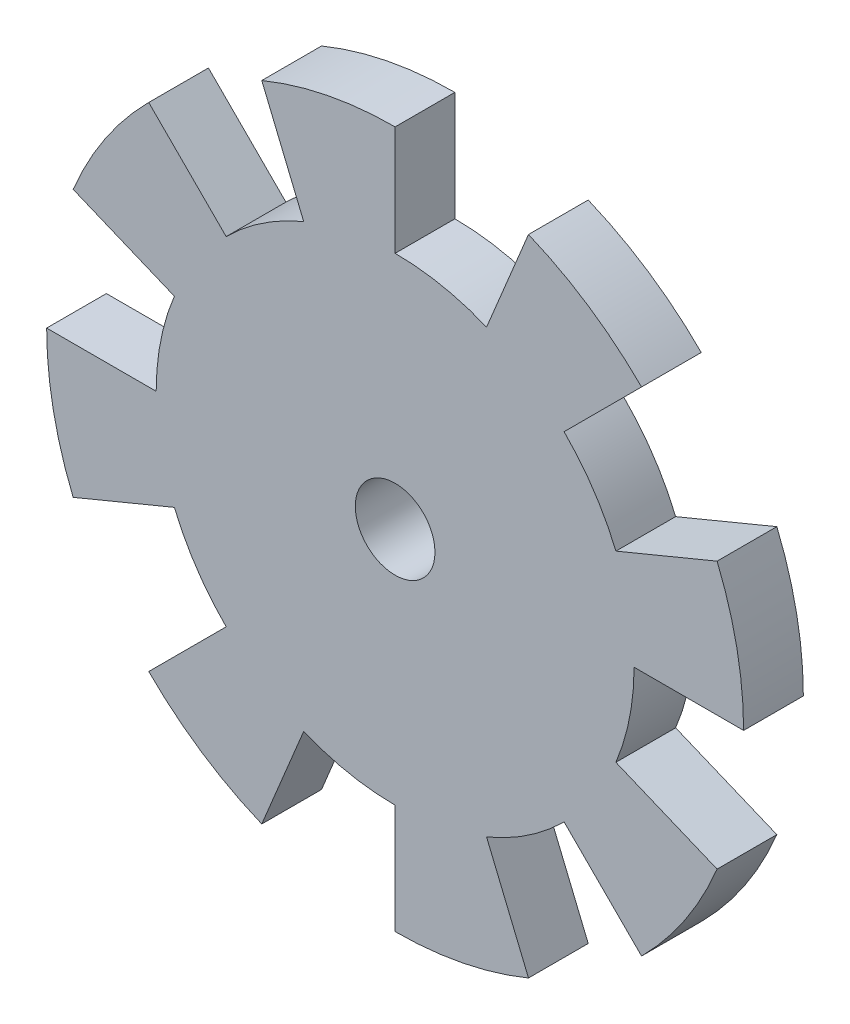
ISO-10303-21;
HEADER;
FILE_DESCRIPTION(('STEP AP214'),'2;1');
FILE_NAME('part.step','',(''),(''),'','','');
FILE_SCHEMA(('AUTOMOTIVE_DESIGN { 1 0 10303 214 1 1 1 1 }'));
ENDSEC;
DATA;
#1=APPLICATION_CONTEXT('core data for automotive mechanical design processes');
#2=APPLICATION_PROTOCOL_DEFINITION('international standard','automotive_design',2000,#1);
#3=PRODUCT_CONTEXT('',#1,'mechanical');
#4=PRODUCT('Part','Part','',(#3));
#5=PRODUCT_RELATED_PRODUCT_CATEGORY('part','',(#4));
#6=PRODUCT_DEFINITION_FORMATION('','',#4);
#7=PRODUCT_DEFINITION_CONTEXT('part definition',#1,'design');
#8=PRODUCT_DEFINITION('design','',#6,#7);
#9=PRODUCT_DEFINITION_SHAPE('','',#8);
#10=(LENGTH_UNIT() NAMED_UNIT(*) SI_UNIT(.MILLI.,.METRE.));
#11=(NAMED_UNIT(*) PLANE_ANGLE_UNIT() SI_UNIT($,.RADIAN.));
#12=(NAMED_UNIT(*) SI_UNIT($,.STERADIAN.) SOLID_ANGLE_UNIT());
#13=UNCERTAINTY_MEASURE_WITH_UNIT(LENGTH_MEASURE(1.E-05),#10,'distance_accuracy_value','');
#14=(GEOMETRIC_REPRESENTATION_CONTEXT(3) GLOBAL_UNCERTAINTY_ASSIGNED_CONTEXT((#13)) GLOBAL_UNIT_ASSIGNED_CONTEXT((#10,
#11,#12)) REPRESENTATION_CONTEXT('',''));
#15=CARTESIAN_POINT('',(0.,0.,0.));
#16=DIRECTION('',(0.,0.,1.));
#17=DIRECTION('',(1.,0.,0.));
#18=AXIS2_PLACEMENT_3D('',#15,#16,#17);
#19=CARTESIAN_POINT('',(0.,0.,6.));
#20=DIRECTION('',(0.,0.,-1.));
#21=DIRECTION('',(-1.,0.,0.));
#22=AXIS2_PLACEMENT_3D('',#19,#20,#21);
#23=CYLINDRICAL_SURFACE('',#22,24.);
#24=CARTESIAN_POINT('',(0.,0.,0.));
#25=DIRECTION('',(0.,0.,1.));
#26=DIRECTION('',(1.,0.,0.));
#27=AXIS2_PLACEMENT_3D('',#24,#25,#26);
#28=CIRCLE('',#27,24.);
#29=CARTESIAN_POINT('',(22.1731087802711,9.18440237676226,0.));
#30=VERTEX_POINT('',#29);
#31=CARTESIAN_POINT('',(16.9705627484782,16.9705627484772,0.));
#32=VERTEX_POINT('',#31);
#33=EDGE_CURVE('E281',#30,#32,#28,.T.);
#34=ORIENTED_EDGE('',*,*,#33,.T.);
#35=DIRECTION('',(0.,0.,-1.));
#36=VECTOR('',#35,1.);
#37=CARTESIAN_POINT('',(16.9705627484782,16.9705627484772,6.));
#38=LINE('',#37,#36);
#39=CARTESIAN_POINT('',(16.9705627484782,16.9705627484772,6.));
#40=VERTEX_POINT('',#39);
#41=EDGE_CURVE('E11',#40,#32,#38,.T.);
#42=ORIENTED_EDGE('',*,*,#41,.F.);
#43=CARTESIAN_POINT('',(0.,0.,6.));
#44=DIRECTION('',(0.,0.,1.));
#45=DIRECTION('',(1.,0.,0.));
#46=AXIS2_PLACEMENT_3D('',#43,#44,#45);
#47=CIRCLE('',#46,24.);
#48=CARTESIAN_POINT('',(22.1731087802711,9.18440237676226,6.));
#49=VERTEX_POINT('',#48);
#50=EDGE_CURVE('E441',#49,#40,#47,.T.);
#51=ORIENTED_EDGE('',*,*,#50,.F.);
#52=DIRECTION('',(0.,0.,-1.));
#53=VECTOR('',#52,1.);
#54=CARTESIAN_POINT('',(22.1731087802711,9.18440237676226,6.));
#55=LINE('',#54,#53);
#56=EDGE_CURVE('E52',#49,#30,#55,.T.);
#57=ORIENTED_EDGE('',*,*,#56,.T.);
#58=EDGE_LOOP('',(#34,#42,#51,#57));
#59=FACE_BOUND('',#58,.T.);
#60=ADVANCED_FACE('F35',(#59),#23,.T.);
#61=CARTESIAN_POINT('',(0.,0.,6.));
#62=DIRECTION('',(-0.707106781186527,0.707106781186567,0.));
#63=DIRECTION('',(-0.707106781186568,-0.707106781186528,0.));
#64=AXIS2_PLACEMENT_3D('',#61,#62,#63);
#65=PLANE('',#64);
#66=DIRECTION('',(0.707106781186568,0.707106781186528,0.));
#67=VECTOR('',#66,1.);
#68=CARTESIAN_POINT('',(0.,0.,0.));
#69=LINE('',#68,#67);
#70=CARTESIAN_POINT('',(24.7487373415292,24.7487373415278,0.));
#71=VERTEX_POINT('',#70);
#72=EDGE_CURVE('E283',#32,#71,#69,.T.);
#73=ORIENTED_EDGE('',*,*,#72,.T.);
#74=DIRECTION('',(0.,0.,-1.));
#75=VECTOR('',#74,1.);
#76=CARTESIAN_POINT('',(24.7487373415292,24.7487373415278,6.));
#77=LINE('',#76,#75);
#78=CARTESIAN_POINT('',(24.7487373415292,24.7487373415278,6.));
#79=VERTEX_POINT('',#78);
#80=EDGE_CURVE('E44',#79,#71,#77,.T.);
#81=ORIENTED_EDGE('',*,*,#80,.F.);
#82=DIRECTION('',(0.707106781186568,0.707106781186528,0.));
#83=VECTOR('',#82,1.);
#84=CARTESIAN_POINT('',(0.,0.,6.));
#85=LINE('',#84,#83);
#86=EDGE_CURVE('E163',#40,#79,#85,.T.);
#87=ORIENTED_EDGE('',*,*,#86,.F.);
#88=ORIENTED_EDGE('',*,*,#41,.T.);
#89=EDGE_LOOP('',(#73,#81,#87,#88));
#90=FACE_BOUND('',#89,.T.);
#91=ADVANCED_FACE('F508',(#90),#65,.F.);
#92=CARTESIAN_POINT('',(0.,0.,6.));
#93=DIRECTION('',(0.,0.,-1.));
#94=DIRECTION('',(-1.,0.,0.));
#95=AXIS2_PLACEMENT_3D('',#92,#93,#94);
#96=CYLINDRICAL_SURFACE('',#95,35.);
#97=CARTESIAN_POINT('',(0.,0.,0.));
#98=DIRECTION('',(0.,0.,1.));
#99=DIRECTION('',(1.,0.,0.));
#100=AXIS2_PLACEMENT_3D('',#97,#98,#99);
#101=CIRCLE('',#100,35.);
#102=CARTESIAN_POINT('',(13.3939201327785,32.335783637895,0.));
#103=VERTEX_POINT('',#102);
#104=EDGE_CURVE('E287',#71,#103,#101,.T.);
#105=ORIENTED_EDGE('',*,*,#104,.T.);
#106=DIRECTION('',(0.,0.,-1.));
#107=VECTOR('',#106,1.);
#108=CARTESIAN_POINT('',(13.3939201327785,32.335783637895,6.));
#109=LINE('',#108,#107);
#110=CARTESIAN_POINT('',(13.3939201327785,32.335783637895,6.));
#111=VERTEX_POINT('',#110);
#112=EDGE_CURVE('E418',#111,#103,#109,.T.);
#113=ORIENTED_EDGE('',*,*,#112,.F.);
#114=CARTESIAN_POINT('',(0.,0.,6.));
#115=DIRECTION('',(0.,0.,1.));
#116=DIRECTION('',(1.,0.,0.));
#117=AXIS2_PLACEMENT_3D('',#114,#115,#116);
#118=CIRCLE('',#117,35.);
#119=EDGE_CURVE('E425',#79,#111,#118,.T.);
#120=ORIENTED_EDGE('',*,*,#119,.F.);
#121=ORIENTED_EDGE('',*,*,#80,.T.);
#122=EDGE_LOOP('',(#105,#113,#120,#121));
#123=FACE_BOUND('',#122,.T.);
#124=ADVANCED_FACE('F423',(#123),#96,.T.);
#125=CARTESIAN_POINT('',(0.,0.,6.));
#126=DIRECTION('',(-0.923879532511283,0.382683432365098,0.));
#127=DIRECTION('',(-0.382683432365098,-0.923879532511284,0.));
#128=AXIS2_PLACEMENT_3D('',#125,#126,#127);
#129=PLANE('',#128);
#130=DIRECTION('',(0.382683432365098,0.923879532511284,0.));
#131=VECTOR('',#130,1.);
#132=CARTESIAN_POINT('',(0.,0.,0.));
#133=LINE('',#132,#131);
#134=CARTESIAN_POINT('',(9.18440237676243,22.173108780271,0.));
#135=VERTEX_POINT('',#134);
#136=EDGE_CURVE('E290',#135,#103,#133,.T.);
#137=ORIENTED_EDGE('',*,*,#136,.F.);
#138=DIRECTION('',(0.,0.,-1.));
#139=VECTOR('',#138,1.);
#140=CARTESIAN_POINT('',(9.18440237676243,22.173108780271,6.));
#141=LINE('',#140,#139);
#142=CARTESIAN_POINT('',(9.18440237676243,22.173108780271,6.));
#143=VERTEX_POINT('',#142);
#144=EDGE_CURVE('E416',#143,#135,#141,.T.);
#145=ORIENTED_EDGE('',*,*,#144,.F.);
#146=DIRECTION('',(0.382683432365098,0.923879532511284,0.));
#147=VECTOR('',#146,1.);
#148=CARTESIAN_POINT('',(0.,0.,6.));
#149=LINE('',#148,#147);
#150=EDGE_CURVE('E436',#143,#111,#149,.T.);
#151=ORIENTED_EDGE('',*,*,#150,.T.);
#152=ORIENTED_EDGE('',*,*,#112,.T.);
#153=EDGE_LOOP('',(#137,#145,#151,#152));
#154=FACE_BOUND('',#153,.T.);
#155=ADVANCED_FACE('F432',(#154),#129,.T.);
#156=CARTESIAN_POINT('',(0.,24.,0.));
#157=VERTEX_POINT('',#156);
#158=EDGE_CURVE('E285',#135,#157,#28,.T.);
#159=ORIENTED_EDGE('',*,*,#158,.T.);
#160=DIRECTION('',(0.,0.,-1.));
#161=VECTOR('',#160,1.);
#162=CARTESIAN_POINT('',(0.,24.,6.));
#163=LINE('',#162,#161);
#164=CARTESIAN_POINT('',(0.,24.,6.));
#165=VERTEX_POINT('',#164);
#166=EDGE_CURVE('E413',#165,#157,#163,.T.);
#167=ORIENTED_EDGE('',*,*,#166,.F.);
#168=EDGE_CURVE('E437',#143,#165,#47,.T.);
#169=ORIENTED_EDGE('',*,*,#168,.F.);
#170=ORIENTED_EDGE('',*,*,#144,.T.);
#171=EDGE_LOOP('',(#159,#167,#169,#170));
#172=FACE_BOUND('',#171,.T.);
#173=ADVANCED_FACE('F510',(#172),#23,.T.);
#174=CARTESIAN_POINT('',(0.,0.,6.));
#175=DIRECTION('',(-1.,0.,0.));
#176=DIRECTION('',(0.,0.,1.));
#177=AXIS2_PLACEMENT_3D('',#174,#175,#176);
#178=PLANE('',#177);
#179=DIRECTION('',(0.,1.,0.));
#180=VECTOR('',#179,1.);
#181=CARTESIAN_POINT('',(0.,0.,0.));
#182=LINE('',#181,#180);
#183=CARTESIAN_POINT('',(0.,35.,0.));
#184=VERTEX_POINT('',#183);
#185=EDGE_CURVE('E293',#157,#184,#182,.T.);
#186=ORIENTED_EDGE('',*,*,#185,.T.);
#187=DIRECTION('',(0.,0.,-1.));
#188=VECTOR('',#187,1.);
#189=CARTESIAN_POINT('',(0.,35.,6.));
#190=LINE('',#189,#188);
#191=CARTESIAN_POINT('',(0.,35.,6.));
#192=VERTEX_POINT('',#191);
#193=EDGE_CURVE('E410',#192,#184,#190,.T.);
#194=ORIENTED_EDGE('',*,*,#193,.F.);
#195=DIRECTION('',(0.,1.,0.));
#196=VECTOR('',#195,1.);
#197=CARTESIAN_POINT('',(0.,0.,6.));
#198=LINE('',#197,#196);
#199=EDGE_CURVE('E439',#165,#192,#198,.T.);
#200=ORIENTED_EDGE('',*,*,#199,.F.);
#201=ORIENTED_EDGE('',*,*,#166,.T.);
#202=EDGE_LOOP('',(#186,#194,#200,#201));
#203=FACE_BOUND('',#202,.T.);
#204=ADVANCED_FACE('F518',(#203),#178,.F.);
#205=CARTESIAN_POINT('',(0.,0.,6.));
#206=DIRECTION('',(0.,0.,-1.));
#207=DIRECTION('',(-1.,0.,0.));
#208=AXIS2_PLACEMENT_3D('',#205,#206,#207);
#209=CYLINDRICAL_SURFACE('',#208,35.);
#210=CARTESIAN_POINT('',(0.,0.,0.));
#211=DIRECTION('',(0.,0.,1.));
#212=DIRECTION('',(1.,0.,0.));
#213=AXIS2_PLACEMENT_3D('',#210,#211,#212);
#214=CIRCLE('',#213,35.);
#215=CARTESIAN_POINT('',(-13.3939201327763,32.3357836378952,0.));
#216=VERTEX_POINT('',#215);
#217=EDGE_CURVE('E295',#184,#216,#214,.T.);
#218=ORIENTED_EDGE('',*,*,#217,.T.);
#219=DIRECTION('',(0.,0.,-1.));
#220=VECTOR('',#219,1.);
#221=CARTESIAN_POINT('',(-13.3939201327763,32.3357836378952,6.));
#222=LINE('',#221,#220);
#223=CARTESIAN_POINT('',(-13.3939201327763,32.3357836378952,6.));
#224=VERTEX_POINT('',#223);
#225=EDGE_CURVE('E408',#224,#216,#222,.T.);
#226=ORIENTED_EDGE('',*,*,#225,.F.);
#227=CARTESIAN_POINT('',(0.,0.,6.));
#228=DIRECTION('',(0.,0.,1.));
#229=DIRECTION('',(1.,0.,0.));
#230=AXIS2_PLACEMENT_3D('',#227,#228,#229);
#231=CIRCLE('',#230,35.);
#232=EDGE_CURVE('E447',#192,#224,#231,.T.);
#233=ORIENTED_EDGE('',*,*,#232,.F.);
#234=ORIENTED_EDGE('',*,*,#193,.T.);
#235=EDGE_LOOP('',(#218,#226,#233,#234));
#236=FACE_BOUND('',#235,.T.);
#237=ADVANCED_FACE('F595',(#236),#209,.T.);
#238=CARTESIAN_POINT('',(0.,0.,6.));
#239=DIRECTION('',(-0.923879532511306,-0.382683432365043,0.));
#240=DIRECTION('',(0.382683432365043,-0.923879532511306,0.));
#241=AXIS2_PLACEMENT_3D('',#238,#239,#240);
#242=PLANE('',#241);
#243=DIRECTION('',(-0.382683432365043,0.923879532511306,0.));
#244=VECTOR('',#243,1.);
#245=CARTESIAN_POINT('',(0.,0.,0.));
#246=LINE('',#245,#244);
#247=CARTESIAN_POINT('',(-9.18440237676087,22.1731087802709,0.));
#248=VERTEX_POINT('',#247);
#249=EDGE_CURVE('E298',#248,#216,#246,.T.);
#250=ORIENTED_EDGE('',*,*,#249,.F.);
#251=DIRECTION('',(0.,0.,-1.));
#252=VECTOR('',#251,1.);
#253=CARTESIAN_POINT('',(-9.18440237676087,22.1731087802709,6.));
#254=LINE('',#253,#252);
#255=CARTESIAN_POINT('',(-9.18440237676087,22.1731087802709,6.));
#256=VERTEX_POINT('',#255);
#257=EDGE_CURVE('E406',#256,#248,#254,.T.);
#258=ORIENTED_EDGE('',*,*,#257,.F.);
#259=DIRECTION('',(-0.382683432365043,0.923879532511306,0.));
#260=VECTOR('',#259,1.);
#261=CARTESIAN_POINT('',(0.,0.,6.));
#262=LINE('',#261,#260);
#263=EDGE_CURVE('E449',#256,#224,#262,.T.);
#264=ORIENTED_EDGE('',*,*,#263,.T.);
#265=ORIENTED_EDGE('',*,*,#225,.T.);
#266=EDGE_LOOP('',(#250,#258,#264,#265));
#267=FACE_BOUND('',#266,.T.);
#268=ADVANCED_FACE('F587',(#267),#242,.T.);
#269=CARTESIAN_POINT('',(-16.970562748477,16.970562748477,0.));
#270=VERTEX_POINT('',#269);
#271=EDGE_CURVE('E301',#248,#270,#28,.T.);
#272=ORIENTED_EDGE('',*,*,#271,.T.);
#273=DIRECTION('',(0.,0.,-1.));
#274=VECTOR('',#273,1.);
#275=CARTESIAN_POINT('',(-16.970562748477,16.970562748477,6.));
#276=LINE('',#275,#274);
#277=CARTESIAN_POINT('',(-16.970562748477,16.970562748477,6.));
#278=VERTEX_POINT('',#277);
#279=EDGE_CURVE('E403',#278,#270,#276,.T.);
#280=ORIENTED_EDGE('',*,*,#279,.F.);
#281=EDGE_CURVE('E442',#256,#278,#47,.T.);
#282=ORIENTED_EDGE('',*,*,#281,.F.);
#283=ORIENTED_EDGE('',*,*,#257,.T.);
#284=EDGE_LOOP('',(#272,#280,#282,#283));
#285=FACE_BOUND('',#284,.T.);
#286=ADVANCED_FACE('F520',(#285),#23,.T.);
#287=CARTESIAN_POINT('',(0.,0.,6.));
#288=DIRECTION('',(-0.707106781186547,-0.707106781186548,0.));
#289=DIRECTION('',(0.707106781186548,-0.707106781186547,0.));
#290=AXIS2_PLACEMENT_3D('',#287,#288,#289);
#291=PLANE('',#290);
#292=DIRECTION('',(-0.707106781186548,0.707106781186547,0.));
#293=VECTOR('',#292,1.);
#294=CARTESIAN_POINT('',(0.,0.,0.));
#295=LINE('',#294,#293);
#296=CARTESIAN_POINT('',(-24.7487373415286,24.7487373415286,0.));
#297=VERTEX_POINT('',#296);
#298=EDGE_CURVE('E302',#270,#297,#295,.T.);
#299=ORIENTED_EDGE('',*,*,#298,.T.);
#300=DIRECTION('',(0.,0.,-1.));
#301=VECTOR('',#300,1.);
#302=CARTESIAN_POINT('',(-24.7487373415286,24.7487373415286,6.));
#303=LINE('',#302,#301);
#304=CARTESIAN_POINT('',(-24.7487373415286,24.7487373415286,6.));
#305=VERTEX_POINT('',#304);
#306=EDGE_CURVE('E400',#305,#297,#303,.T.);
#307=ORIENTED_EDGE('',*,*,#306,.F.);
#308=DIRECTION('',(-0.707106781186548,0.707106781186547,0.));
#309=VECTOR('',#308,1.);
#310=CARTESIAN_POINT('',(0.,0.,6.));
#311=LINE('',#310,#309);
#312=EDGE_CURVE('E452',#278,#305,#311,.T.);
#313=ORIENTED_EDGE('',*,*,#312,.F.);
#314=ORIENTED_EDGE('',*,*,#279,.T.);
#315=EDGE_LOOP('',(#299,#307,#313,#314));
#316=FACE_BOUND('',#315,.T.);
#317=ADVANCED_FACE('F586',(#316),#291,.F.);
#318=CARTESIAN_POINT('',(0.,0.,6.));
#319=DIRECTION('',(0.,0.,-1.));
#320=DIRECTION('',(-1.,0.,0.));
#321=AXIS2_PLACEMENT_3D('',#318,#319,#320);
#322=CYLINDRICAL_SURFACE('',#321,35.);
#323=CARTESIAN_POINT('',(0.,0.,0.));
#324=DIRECTION('',(0.,0.,1.));
#325=DIRECTION('',(1.,0.,0.));
#326=AXIS2_PLACEMENT_3D('',#323,#324,#325);
#327=CIRCLE('',#326,35.);
#328=CARTESIAN_POINT('',(-32.3357836378945,13.3939201327779,0.));
#329=VERTEX_POINT('',#328);
#330=EDGE_CURVE('E304',#297,#329,#327,.T.);
#331=ORIENTED_EDGE('',*,*,#330,.T.);
#332=DIRECTION('',(0.,0.,-1.));
#333=VECTOR('',#332,1.);
#334=CARTESIAN_POINT('',(-32.3357836378945,13.3939201327779,6.));
#335=LINE('',#334,#333);
#336=CARTESIAN_POINT('',(-32.3357836378945,13.3939201327779,6.));
#337=VERTEX_POINT('',#336);
#338=EDGE_CURVE('E398',#337,#329,#335,.T.);
#339=ORIENTED_EDGE('',*,*,#338,.F.);
#340=CARTESIAN_POINT('',(0.,0.,6.));
#341=DIRECTION('',(0.,0.,1.));
#342=DIRECTION('',(1.,0.,0.));
#343=AXIS2_PLACEMENT_3D('',#340,#341,#342);
#344=CIRCLE('',#343,35.);
#345=EDGE_CURVE('E454',#305,#337,#344,.T.);
#346=ORIENTED_EDGE('',*,*,#345,.F.);
#347=ORIENTED_EDGE('',*,*,#306,.T.);
#348=EDGE_LOOP('',(#331,#339,#346,#347));
#349=FACE_BOUND('',#348,.T.);
#350=ADVANCED_FACE('F582',(#349),#322,.T.);
#351=CARTESIAN_POINT('',(0.,0.,6.));
#352=DIRECTION('',(-0.38268343236509,-0.923879532511287,0.));
#353=DIRECTION('',(0.923879532511287,-0.38268343236509,0.));
#354=AXIS2_PLACEMENT_3D('',#351,#352,#353);
#355=PLANE('',#354);
#356=DIRECTION('',(-0.923879532511287,0.38268343236509,0.));
#357=VECTOR('',#356,1.);
#358=CARTESIAN_POINT('',(0.,0.,0.));
#359=LINE('',#358,#357);
#360=CARTESIAN_POINT('',(-22.1731087802706,9.18440237676205,0.));
#361=VERTEX_POINT('',#360);
#362=EDGE_CURVE('E307',#361,#329,#359,.T.);
#363=ORIENTED_EDGE('',*,*,#362,.F.);
#364=DIRECTION('',(0.,0.,-1.));
#365=VECTOR('',#364,1.);
#366=CARTESIAN_POINT('',(-22.1731087802706,9.18440237676205,6.));
#367=LINE('',#366,#365);
#368=CARTESIAN_POINT('',(-22.1731087802706,9.18440237676205,6.));
#369=VERTEX_POINT('',#368);
#370=EDGE_CURVE('E396',#369,#361,#367,.T.);
#371=ORIENTED_EDGE('',*,*,#370,.F.);
#372=DIRECTION('',(-0.923879532511287,0.38268343236509,0.));
#373=VECTOR('',#372,1.);
#374=CARTESIAN_POINT('',(0.,0.,6.));
#375=LINE('',#374,#373);
#376=EDGE_CURVE('E456',#369,#337,#375,.T.);
#377=ORIENTED_EDGE('',*,*,#376,.T.);
#378=ORIENTED_EDGE('',*,*,#338,.T.);
#379=EDGE_LOOP('',(#363,#371,#377,#378));
#380=FACE_BOUND('',#379,.T.);
#381=ADVANCED_FACE('F574',(#380),#355,.T.);
#382=CARTESIAN_POINT('',(-23.9999999999996,0.,0.));
#383=VERTEX_POINT('',#382);
#384=EDGE_CURVE('E310',#361,#383,#28,.T.);
#385=ORIENTED_EDGE('',*,*,#384,.T.);
#386=DIRECTION('',(0.,0.,-1.));
#387=VECTOR('',#386,1.);
#388=CARTESIAN_POINT('',(-23.9999999999996,0.,6.));
#389=LINE('',#388,#387);
#390=CARTESIAN_POINT('',(-23.9999999999996,0.,6.));
#391=VERTEX_POINT('',#390);
#392=EDGE_CURVE('E393',#391,#383,#389,.T.);
#393=ORIENTED_EDGE('',*,*,#392,.F.);
#394=EDGE_CURVE('E459',#369,#391,#47,.T.);
#395=ORIENTED_EDGE('',*,*,#394,.F.);
#396=ORIENTED_EDGE('',*,*,#370,.T.);
#397=EDGE_LOOP('',(#385,#393,#395,#396));
#398=FACE_BOUND('',#397,.T.);
#399=ADVANCED_FACE('F562',(#398),#23,.T.);
#400=CARTESIAN_POINT('',(0.,0.,6.));
#401=DIRECTION('',(0.,-1.,0.));
#402=DIRECTION('',(1.,0.,0.));
#403=AXIS2_PLACEMENT_3D('',#400,#401,#402);
#404=PLANE('',#403);
#405=DIRECTION('',(-1.,0.,0.));
#406=VECTOR('',#405,1.);
#407=CARTESIAN_POINT('',(0.,0.,0.));
#408=LINE('',#407,#406);
#409=CARTESIAN_POINT('',(-34.9999999999992,0.,0.));
#410=VERTEX_POINT('',#409);
#411=EDGE_CURVE('E311',#383,#410,#408,.T.);
#412=ORIENTED_EDGE('',*,*,#411,.T.);
#413=DIRECTION('',(0.,0.,-1.));
#414=VECTOR('',#413,1.);
#415=CARTESIAN_POINT('',(-34.9999999999992,0.,6.));
#416=LINE('',#415,#414);
#417=CARTESIAN_POINT('',(-34.9999999999992,0.,6.));
#418=VERTEX_POINT('',#417);
#419=EDGE_CURVE('E390',#418,#410,#416,.T.);
#420=ORIENTED_EDGE('',*,*,#419,.F.);
#421=DIRECTION('',(-1.,0.,0.));
#422=VECTOR('',#421,1.);
#423=CARTESIAN_POINT('',(0.,0.,6.));
#424=LINE('',#423,#422);
#425=EDGE_CURVE('E460',#391,#418,#424,.T.);
#426=ORIENTED_EDGE('',*,*,#425,.F.);
#427=ORIENTED_EDGE('',*,*,#392,.T.);
#428=EDGE_LOOP('',(#412,#420,#426,#427));
#429=FACE_BOUND('',#428,.T.);
#430=ADVANCED_FACE('F573',(#429),#404,.F.);
#431=CARTESIAN_POINT('',(0.,0.,6.));
#432=DIRECTION('',(0.,0.,-1.));
#433=DIRECTION('',(-1.,0.,0.));
#434=AXIS2_PLACEMENT_3D('',#431,#432,#433);
#435=CYLINDRICAL_SURFACE('',#434,35.);
#436=CARTESIAN_POINT('',(0.,0.,0.));
#437=DIRECTION('',(0.,0.,1.));
#438=DIRECTION('',(1.,0.,0.));
#439=AXIS2_PLACEMENT_3D('',#436,#437,#438);
#440=CIRCLE('',#439,35.);
#441=CARTESIAN_POINT('',(-32.3357836378939,-13.3939201327777,0.));
#442=VERTEX_POINT('',#441);
#443=EDGE_CURVE('E313',#410,#442,#440,.T.);
#444=ORIENTED_EDGE('',*,*,#443,.T.);
#445=DIRECTION('',(0.,0.,-1.));
#446=VECTOR('',#445,1.);
#447=CARTESIAN_POINT('',(-32.3357836378939,-13.3939201327777,6.));
#448=LINE('',#447,#446);
#449=CARTESIAN_POINT('',(-32.3357836378939,-13.3939201327777,6.));
#450=VERTEX_POINT('',#449);
#451=EDGE_CURVE('E388',#450,#442,#448,.T.);
#452=ORIENTED_EDGE('',*,*,#451,.F.);
#453=CARTESIAN_POINT('',(0.,0.,6.));
#454=DIRECTION('',(0.,0.,1.));
#455=DIRECTION('',(1.,0.,0.));
#456=AXIS2_PLACEMENT_3D('',#453,#454,#455);
#457=CIRCLE('',#456,35.);
#458=EDGE_CURVE('E462',#418,#450,#457,.T.);
#459=ORIENTED_EDGE('',*,*,#458,.F.);
#460=ORIENTED_EDGE('',*,*,#419,.T.);
#461=EDGE_LOOP('',(#444,#452,#459,#460));
#462=FACE_BOUND('',#461,.T.);
#463=ADVANCED_FACE('F569',(#462),#435,.T.);
#464=CARTESIAN_POINT('',(0.,0.,6.));
#465=DIRECTION('',(0.38268343236509,-0.923879532511286,0.));
#466=DIRECTION('',(0.923879532511287,0.38268343236509,0.));
#467=AXIS2_PLACEMENT_3D('',#464,#465,#466);
#468=PLANE('',#467);
#469=DIRECTION('',(-0.923879532511287,-0.38268343236509,0.));
#470=VECTOR('',#469,1.);
#471=CARTESIAN_POINT('',(0.,0.,0.));
#472=LINE('',#471,#470);
#473=CARTESIAN_POINT('',(-22.1731087802703,-9.18440237676193,0.));
#474=VERTEX_POINT('',#473);
#475=EDGE_CURVE('E316',#474,#442,#472,.T.);
#476=ORIENTED_EDGE('',*,*,#475,.F.);
#477=DIRECTION('',(0.,0.,-1.));
#478=VECTOR('',#477,1.);
#479=CARTESIAN_POINT('',(-22.1731087802703,-9.18440237676193,6.));
#480=LINE('',#479,#478);
#481=CARTESIAN_POINT('',(-22.1731087802703,-9.18440237676193,6.));
#482=VERTEX_POINT('',#481);
#483=EDGE_CURVE('E386',#482,#474,#480,.T.);
#484=ORIENTED_EDGE('',*,*,#483,.F.);
#485=DIRECTION('',(-0.923879532511287,-0.38268343236509,0.));
#486=VECTOR('',#485,1.);
#487=CARTESIAN_POINT('',(0.,0.,6.));
#488=LINE('',#487,#486);
#489=EDGE_CURVE('E464',#482,#450,#488,.T.);
#490=ORIENTED_EDGE('',*,*,#489,.T.);
#491=ORIENTED_EDGE('',*,*,#451,.T.);
#492=EDGE_LOOP('',(#476,#484,#490,#491));
#493=FACE_BOUND('',#492,.T.);
#494=ADVANCED_FACE('F560',(#493),#468,.T.);
#495=CARTESIAN_POINT('',(-16.9705627484774,-16.9705627484774,0.));
#496=VERTEX_POINT('',#495);
#497=EDGE_CURVE('E319',#474,#496,#28,.T.);
#498=ORIENTED_EDGE('',*,*,#497,.T.);
#499=DIRECTION('',(0.,0.,-1.));
#500=VECTOR('',#499,1.);
#501=CARTESIAN_POINT('',(-16.9705627484774,-16.9705627484774,6.));
#502=LINE('',#501,#500);
#503=CARTESIAN_POINT('',(-16.9705627484774,-16.9705627484774,6.));
#504=VERTEX_POINT('',#503);
#505=EDGE_CURVE('E383',#504,#496,#502,.T.);
#506=ORIENTED_EDGE('',*,*,#505,.F.);
#507=EDGE_CURVE('E467',#482,#504,#47,.T.);
#508=ORIENTED_EDGE('',*,*,#507,.F.);
#509=ORIENTED_EDGE('',*,*,#483,.T.);
#510=EDGE_LOOP('',(#498,#506,#508,#509));
#511=FACE_BOUND('',#510,.T.);
#512=ADVANCED_FACE('F548',(#511),#23,.T.);
#513=CARTESIAN_POINT('',(0.,0.,6.));
#514=DIRECTION('',(0.707106781186548,-0.707106781186547,0.));
#515=DIRECTION('',(0.707106781186547,0.707106781186548,0.));
#516=AXIS2_PLACEMENT_3D('',#513,#514,#515);
#517=PLANE('',#516);
#518=DIRECTION('',(-0.707106781186547,-0.707106781186548,0.));
#519=VECTOR('',#518,1.);
#520=CARTESIAN_POINT('',(0.,0.,0.));
#521=LINE('',#520,#519);
#522=CARTESIAN_POINT('',(-24.7487373415277,-24.7487373415277,0.));
#523=VERTEX_POINT('',#522);
#524=EDGE_CURVE('E320',#496,#523,#521,.T.);
#525=ORIENTED_EDGE('',*,*,#524,.T.);
#526=DIRECTION('',(0.,0.,-1.));
#527=VECTOR('',#526,1.);
#528=CARTESIAN_POINT('',(-24.7487373415277,-24.7487373415277,6.));
#529=LINE('',#528,#527);
#530=CARTESIAN_POINT('',(-24.7487373415277,-24.7487373415277,6.));
#531=VERTEX_POINT('',#530);
#532=EDGE_CURVE('E380',#531,#523,#529,.T.);
#533=ORIENTED_EDGE('',*,*,#532,.F.);
#534=DIRECTION('',(-0.707106781186547,-0.707106781186548,0.));
#535=VECTOR('',#534,1.);
#536=CARTESIAN_POINT('',(0.,0.,6.));
#537=LINE('',#536,#535);
#538=EDGE_CURVE('E468',#504,#531,#537,.T.);
#539=ORIENTED_EDGE('',*,*,#538,.F.);
#540=ORIENTED_EDGE('',*,*,#505,.T.);
#541=EDGE_LOOP('',(#525,#533,#539,#540));
#542=FACE_BOUND('',#541,.T.);
#543=ADVANCED_FACE('F559',(#542),#517,.F.);
#544=CARTESIAN_POINT('',(0.,0.,6.));
#545=DIRECTION('',(0.,0.,-1.));
#546=DIRECTION('',(-1.,0.,0.));
#547=AXIS2_PLACEMENT_3D('',#544,#545,#546);
#548=CYLINDRICAL_SURFACE('',#547,35.);
#549=CARTESIAN_POINT('',(0.,0.,0.));
#550=DIRECTION('',(0.,0.,1.));
#551=DIRECTION('',(1.,0.,0.));
#552=AXIS2_PLACEMENT_3D('',#549,#550,#551);
#553=CIRCLE('',#552,35.);
#554=CARTESIAN_POINT('',(-13.3939201327783,-32.3357836378954,0.));
#555=VERTEX_POINT('',#554);
#556=EDGE_CURVE('E322',#523,#555,#553,.T.);
#557=ORIENTED_EDGE('',*,*,#556,.T.);
#558=DIRECTION('',(0.,0.,-1.));
#559=VECTOR('',#558,1.);
#560=CARTESIAN_POINT('',(-13.3939201327783,-32.3357836378954,6.));
#561=LINE('',#560,#559);
#562=CARTESIAN_POINT('',(-13.3939201327783,-32.3357836378954,6.));
#563=VERTEX_POINT('',#562);
#564=EDGE_CURVE('E378',#563,#555,#561,.T.);
#565=ORIENTED_EDGE('',*,*,#564,.F.);
#566=CARTESIAN_POINT('',(0.,0.,6.));
#567=DIRECTION('',(0.,0.,1.));
#568=DIRECTION('',(1.,0.,0.));
#569=AXIS2_PLACEMENT_3D('',#566,#567,#568);
#570=CIRCLE('',#569,35.);
#571=EDGE_CURVE('E470',#531,#563,#570,.T.);
#572=ORIENTED_EDGE('',*,*,#571,.F.);
#573=ORIENTED_EDGE('',*,*,#532,.T.);
#574=EDGE_LOOP('',(#557,#565,#572,#573));
#575=FACE_BOUND('',#574,.T.);
#576=ADVANCED_FACE('F555',(#575),#548,.T.);
#577=CARTESIAN_POINT('',(0.,0.,6.));
#578=DIRECTION('',(0.923879532511287,-0.38268343236509,0.));
#579=DIRECTION('',(0.38268343236509,0.923879532511287,0.));
#580=AXIS2_PLACEMENT_3D('',#577,#578,#579);
#581=PLANE('',#580);
#582=DIRECTION('',(-0.38268343236509,-0.923879532511287,0.));
#583=VECTOR('',#582,1.);
#584=CARTESIAN_POINT('',(0.,0.,0.));
#585=LINE('',#584,#583);
#586=CARTESIAN_POINT('',(-9.18440237676222,-22.173108780271,0.));
#587=VERTEX_POINT('',#586);
#588=EDGE_CURVE('E325',#587,#555,#585,.T.);
#589=ORIENTED_EDGE('',*,*,#588,.F.);
#590=DIRECTION('',(0.,0.,-1.));
#591=VECTOR('',#590,1.);
#592=CARTESIAN_POINT('',(-9.18440237676222,-22.173108780271,6.));
#593=LINE('',#592,#591);
#594=CARTESIAN_POINT('',(-9.18440237676222,-22.173108780271,6.));
#595=VERTEX_POINT('',#594);
#596=EDGE_CURVE('E376',#595,#587,#593,.T.);
#597=ORIENTED_EDGE('',*,*,#596,.F.);
#598=DIRECTION('',(-0.38268343236509,-0.923879532511287,0.));
#599=VECTOR('',#598,1.);
#600=CARTESIAN_POINT('',(0.,0.,6.));
#601=LINE('',#600,#599);
#602=EDGE_CURVE('E472',#595,#563,#601,.T.);
#603=ORIENTED_EDGE('',*,*,#602,.T.);
#604=ORIENTED_EDGE('',*,*,#564,.T.);
#605=EDGE_LOOP('',(#589,#597,#603,#604));
#606=FACE_BOUND('',#605,.T.);
#607=ADVANCED_FACE('F546',(#606),#581,.T.);
#608=CARTESIAN_POINT('',(0.,-24.,0.));
#609=VERTEX_POINT('',#608);
#610=EDGE_CURVE('E328',#587,#609,#28,.T.);
#611=ORIENTED_EDGE('',*,*,#610,.T.);
#612=DIRECTION('',(0.,0.,-1.));
#613=VECTOR('',#612,1.);
#614=CARTESIAN_POINT('',(0.,-24.,6.));
#615=LINE('',#614,#613);
#616=CARTESIAN_POINT('',(0.,-24.,6.));
#617=VERTEX_POINT('',#616);
#618=EDGE_CURVE('E373',#617,#609,#615,.T.);
#619=ORIENTED_EDGE('',*,*,#618,.F.);
#620=EDGE_CURVE('E475',#595,#617,#47,.T.);
#621=ORIENTED_EDGE('',*,*,#620,.F.);
#622=ORIENTED_EDGE('',*,*,#596,.T.);
#623=EDGE_LOOP('',(#611,#619,#621,#622));
#624=FACE_BOUND('',#623,.T.);
#625=ADVANCED_FACE('F534',(#624),#23,.T.);
#626=CARTESIAN_POINT('',(0.,0.,6.));
#627=DIRECTION('',(1.,0.,0.));
#628=DIRECTION('',(0.,1.,0.));
#629=AXIS2_PLACEMENT_3D('',#626,#627,#628);
#630=PLANE('',#629);
#631=DIRECTION('',(0.,-1.,0.));
#632=VECTOR('',#631,1.);
#633=CARTESIAN_POINT('',(0.,0.,0.));
#634=LINE('',#633,#632);
#635=CARTESIAN_POINT('',(0.,-35.,0.));
#636=VERTEX_POINT('',#635);
#637=EDGE_CURVE('E329',#609,#636,#634,.T.);
#638=ORIENTED_EDGE('',*,*,#637,.T.);
#639=DIRECTION('',(0.,0.,-1.));
#640=VECTOR('',#639,1.);
#641=CARTESIAN_POINT('',(0.,-35.,6.));
#642=LINE('',#641,#640);
#643=CARTESIAN_POINT('',(0.,-35.,6.));
#644=VERTEX_POINT('',#643);
#645=EDGE_CURVE('E370',#644,#636,#642,.T.);
#646=ORIENTED_EDGE('',*,*,#645,.F.);
#647=DIRECTION('',(0.,-1.,0.));
#648=VECTOR('',#647,1.);
#649=CARTESIAN_POINT('',(0.,0.,6.));
#650=LINE('',#649,#648);
#651=EDGE_CURVE('E476',#617,#644,#650,.T.);
#652=ORIENTED_EDGE('',*,*,#651,.F.);
#653=ORIENTED_EDGE('',*,*,#618,.T.);
#654=EDGE_LOOP('',(#638,#646,#652,#653));
#655=FACE_BOUND('',#654,.T.);
#656=ADVANCED_FACE('F545',(#655),#630,.F.);
#657=CARTESIAN_POINT('',(0.,0.,6.));
#658=DIRECTION('',(0.,0.,-1.));
#659=DIRECTION('',(-1.,0.,0.));
#660=AXIS2_PLACEMENT_3D('',#657,#658,#659);
#661=CYLINDRICAL_SURFACE('',#660,35.);
#662=CARTESIAN_POINT('',(0.,0.,0.));
#663=DIRECTION('',(0.,0.,1.));
#664=DIRECTION('',(1.,0.,0.));
#665=AXIS2_PLACEMENT_3D('',#662,#663,#664);
#666=CIRCLE('',#665,35.);
#667=CARTESIAN_POINT('',(13.393920132778,-32.3357836378947,0.));
#668=VERTEX_POINT('',#667);
#669=EDGE_CURVE('E331',#636,#668,#666,.T.);
#670=ORIENTED_EDGE('',*,*,#669,.T.);
#671=DIRECTION('',(0.,0.,-1.));
#672=VECTOR('',#671,1.);
#673=CARTESIAN_POINT('',(13.393920132778,-32.3357836378947,6.));
#674=LINE('',#673,#672);
#675=CARTESIAN_POINT('',(13.393920132778,-32.3357836378947,6.));
#676=VERTEX_POINT('',#675);
#677=EDGE_CURVE('E368',#676,#668,#674,.T.);
#678=ORIENTED_EDGE('',*,*,#677,.F.);
#679=CARTESIAN_POINT('',(0.,0.,6.));
#680=DIRECTION('',(0.,0.,1.));
#681=DIRECTION('',(1.,0.,0.));
#682=AXIS2_PLACEMENT_3D('',#679,#680,#681);
#683=CIRCLE('',#682,35.);
#684=EDGE_CURVE('E478',#644,#676,#683,.T.);
#685=ORIENTED_EDGE('',*,*,#684,.F.);
#686=ORIENTED_EDGE('',*,*,#645,.T.);
#687=EDGE_LOOP('',(#670,#678,#685,#686));
#688=FACE_BOUND('',#687,.T.);
#689=ADVANCED_FACE('F541',(#688),#661,.T.);
#690=CARTESIAN_POINT('',(0.,0.,6.));
#691=DIRECTION('',(0.923879532511287,0.38268343236509,0.));
#692=DIRECTION('',(-0.38268343236509,0.923879532511287,0.));
#693=AXIS2_PLACEMENT_3D('',#690,#691,#692);
#694=PLANE('',#693);
#695=DIRECTION('',(0.38268343236509,-0.923879532511287,0.));
#696=VECTOR('',#695,1.);
#697=CARTESIAN_POINT('',(0.,0.,0.));
#698=LINE('',#697,#696);
#699=CARTESIAN_POINT('',(9.1844023767621,-22.1731087802707,0.));
#700=VERTEX_POINT('',#699);
#701=EDGE_CURVE('E334',#700,#668,#698,.T.);
#702=ORIENTED_EDGE('',*,*,#701,.F.);
#703=DIRECTION('',(0.,0.,-1.));
#704=VECTOR('',#703,1.);
#705=CARTESIAN_POINT('',(9.1844023767621,-22.1731087802707,6.));
#706=LINE('',#705,#704);
#707=CARTESIAN_POINT('',(9.1844023767621,-22.1731087802707,6.));
#708=VERTEX_POINT('',#707);
#709=EDGE_CURVE('E366',#708,#700,#706,.T.);
#710=ORIENTED_EDGE('',*,*,#709,.F.);
#711=DIRECTION('',(0.38268343236509,-0.923879532511287,0.));
#712=VECTOR('',#711,1.);
#713=CARTESIAN_POINT('',(0.,0.,6.));
#714=LINE('',#713,#712);
#715=EDGE_CURVE('E480',#708,#676,#714,.T.);
#716=ORIENTED_EDGE('',*,*,#715,.T.);
#717=ORIENTED_EDGE('',*,*,#677,.T.);
#718=EDGE_LOOP('',(#702,#710,#716,#717));
#719=FACE_BOUND('',#718,.T.);
#720=ADVANCED_FACE('F532',(#719),#694,.T.);
#721=CARTESIAN_POINT('',(16.9705627484779,-16.9705627484779,0.));
#722=VERTEX_POINT('',#721);
#723=EDGE_CURVE('E337',#700,#722,#28,.T.);
#724=ORIENTED_EDGE('',*,*,#723,.T.);
#725=DIRECTION('',(0.,0.,-1.));
#726=VECTOR('',#725,1.);
#727=CARTESIAN_POINT('',(16.9705627484779,-16.9705627484779,6.));
#728=LINE('',#727,#726);
#729=CARTESIAN_POINT('',(16.9705627484779,-16.9705627484779,6.));
#730=VERTEX_POINT('',#729);
#731=EDGE_CURVE('E363',#730,#722,#728,.T.);
#732=ORIENTED_EDGE('',*,*,#731,.F.);
#733=EDGE_CURVE('E483',#708,#730,#47,.T.);
#734=ORIENTED_EDGE('',*,*,#733,.F.);
#735=ORIENTED_EDGE('',*,*,#709,.T.);
#736=EDGE_LOOP('',(#724,#732,#734,#735));
#737=FACE_BOUND('',#736,.T.);
#738=ADVANCED_FACE('F524',(#737),#23,.T.);
#739=CARTESIAN_POINT('',(0.,0.,6.));
#740=DIRECTION('',(0.707106781186547,0.707106781186547,0.));
#741=DIRECTION('',(-0.707106781186548,0.707106781186548,0.));
#742=AXIS2_PLACEMENT_3D('',#739,#740,#741);
#743=PLANE('',#742);
#744=DIRECTION('',(0.707106781186548,-0.707106781186548,0.));
#745=VECTOR('',#744,1.);
#746=CARTESIAN_POINT('',(0.,0.,0.));
#747=LINE('',#746,#745);
#748=CARTESIAN_POINT('',(24.7487373415286,-24.7487373415286,0.));
#749=VERTEX_POINT('',#748);
#750=EDGE_CURVE('E338',#722,#749,#747,.T.);
#751=ORIENTED_EDGE('',*,*,#750,.T.);
#752=DIRECTION('',(0.,0.,-1.));
#753=VECTOR('',#752,1.);
#754=CARTESIAN_POINT('',(24.7487373415286,-24.7487373415286,6.));
#755=LINE('',#754,#753);
#756=CARTESIAN_POINT('',(24.7487373415286,-24.7487373415286,6.));
#757=VERTEX_POINT('',#756);
#758=EDGE_CURVE('E360',#757,#749,#755,.T.);
#759=ORIENTED_EDGE('',*,*,#758,.F.);
#760=DIRECTION('',(0.707106781186548,-0.707106781186548,0.));
#761=VECTOR('',#760,1.);
#762=CARTESIAN_POINT('',(0.,0.,6.));
#763=LINE('',#762,#761);
#764=EDGE_CURVE('E484',#730,#757,#763,.T.);
#765=ORIENTED_EDGE('',*,*,#764,.F.);
#766=ORIENTED_EDGE('',*,*,#731,.T.);
#767=EDGE_LOOP('',(#751,#759,#765,#766));
#768=FACE_BOUND('',#767,.T.);
#769=ADVANCED_FACE('F531',(#768),#743,.F.);
#770=CARTESIAN_POINT('',(0.,0.,6.));
#771=DIRECTION('',(0.,0.,-1.));
#772=DIRECTION('',(-1.,0.,0.));
#773=AXIS2_PLACEMENT_3D('',#770,#771,#772);
#774=CYLINDRICAL_SURFACE('',#773,35.);
#775=CARTESIAN_POINT('',(0.,0.,0.));
#776=DIRECTION('',(0.,0.,1.));
#777=DIRECTION('',(1.,0.,0.));
#778=AXIS2_PLACEMENT_3D('',#775,#776,#777);
#779=CIRCLE('',#778,35.);
#780=CARTESIAN_POINT('',(32.3357836378962,-13.3939201327786,0.));
#781=VERTEX_POINT('',#780);
#782=EDGE_CURVE('E340',#749,#781,#779,.T.);
#783=ORIENTED_EDGE('',*,*,#782,.T.);
#784=DIRECTION('',(0.,0.,-1.));
#785=VECTOR('',#784,1.);
#786=CARTESIAN_POINT('',(32.3357836378962,-13.3939201327786,6.));
#787=LINE('',#786,#785);
#788=CARTESIAN_POINT('',(32.3357836378962,-13.3939201327786,6.));
#789=VERTEX_POINT('',#788);
#790=EDGE_CURVE('E358',#789,#781,#787,.T.);
#791=ORIENTED_EDGE('',*,*,#790,.F.);
#792=CARTESIAN_POINT('',(0.,0.,6.));
#793=DIRECTION('',(0.,0.,1.));
#794=DIRECTION('',(1.,0.,0.));
#795=AXIS2_PLACEMENT_3D('',#792,#793,#794);
#796=CIRCLE('',#795,35.);
#797=EDGE_CURVE('E486',#757,#789,#796,.T.);
#798=ORIENTED_EDGE('',*,*,#797,.F.);
#799=ORIENTED_EDGE('',*,*,#758,.T.);
#800=EDGE_LOOP('',(#783,#791,#798,#799));
#801=FACE_BOUND('',#800,.T.);
#802=ADVANCED_FACE('F529',(#801),#774,.T.);
#803=CARTESIAN_POINT('',(0.,0.,6.));
#804=DIRECTION('',(0.38268343236509,0.923879532511287,0.));
#805=DIRECTION('',(-0.923879532511287,0.38268343236509,0.));
#806=AXIS2_PLACEMENT_3D('',#803,#804,#805);
#807=PLANE('',#806);
#808=DIRECTION('',(0.923879532511287,-0.38268343236509,0.));
#809=VECTOR('',#808,1.);
#810=CARTESIAN_POINT('',(0.,0.,0.));
#811=LINE('',#810,#809);
#812=CARTESIAN_POINT('',(22.1731087802715,-9.1844023767624,0.));
#813=VERTEX_POINT('',#812);
#814=EDGE_CURVE('E343',#813,#781,#811,.T.);
#815=ORIENTED_EDGE('',*,*,#814,.F.);
#816=DIRECTION('',(0.,0.,-1.));
#817=VECTOR('',#816,1.);
#818=CARTESIAN_POINT('',(22.1731087802715,-9.1844023767624,6.));
#819=LINE('',#818,#817);
#820=CARTESIAN_POINT('',(22.1731087802715,-9.1844023767624,6.));
#821=VERTEX_POINT('',#820);
#822=EDGE_CURVE('E356',#821,#813,#819,.T.);
#823=ORIENTED_EDGE('',*,*,#822,.F.);
#824=DIRECTION('',(0.923879532511287,-0.38268343236509,0.));
#825=VECTOR('',#824,1.);
#826=CARTESIAN_POINT('',(0.,0.,6.));
#827=LINE('',#826,#825);
#828=EDGE_CURVE('E487',#821,#789,#827,.T.);
#829=ORIENTED_EDGE('',*,*,#828,.T.);
#830=ORIENTED_EDGE('',*,*,#790,.T.);
#831=EDGE_LOOP('',(#815,#823,#829,#830));
#832=FACE_BOUND('',#831,.T.);
#833=ADVANCED_FACE('F522',(#832),#807,.T.);
#834=CARTESIAN_POINT('',(24.0000000000004,0.,0.));
#835=VERTEX_POINT('',#834);
#836=EDGE_CURVE('E284',#813,#835,#28,.T.);
#837=ORIENTED_EDGE('',*,*,#836,.T.);
#838=DIRECTION('',(0.,0.,-1.));
#839=VECTOR('',#838,1.);
#840=CARTESIAN_POINT('',(24.0000000000004,0.,6.));
#841=LINE('',#840,#839);
#842=CARTESIAN_POINT('',(24.0000000000004,0.,6.));
#843=VERTEX_POINT('',#842);
#844=EDGE_CURVE('E270',#843,#835,#841,.T.);
#845=ORIENTED_EDGE('',*,*,#844,.F.);
#846=EDGE_CURVE('E258',#821,#843,#47,.T.);
#847=ORIENTED_EDGE('',*,*,#846,.F.);
#848=ORIENTED_EDGE('',*,*,#822,.T.);
#849=EDGE_LOOP('',(#837,#845,#847,#848));
#850=FACE_BOUND('',#849,.T.);
#851=ADVANCED_FACE('F511',(#850),#23,.T.);
#852=CARTESIAN_POINT('',(0.,0.,6.));
#853=DIRECTION('',(0.,1.,0.));
#854=DIRECTION('',(-1.,0.,0.));
#855=AXIS2_PLACEMENT_3D('',#852,#853,#854);
#856=PLANE('',#855);
#857=DIRECTION('',(1.,0.,0.));
#858=VECTOR('',#857,1.);
#859=CARTESIAN_POINT('',(0.,0.,0.));
#860=LINE('',#859,#858);
#861=CARTESIAN_POINT('',(35.0000000000009,0.,0.));
#862=VERTEX_POINT('',#861);
#863=EDGE_CURVE('E267',#835,#862,#860,.T.);
#864=ORIENTED_EDGE('',*,*,#863,.T.);
#865=DIRECTION('',(0.,0.,-1.));
#866=VECTOR('',#865,1.);
#867=CARTESIAN_POINT('',(35.0000000000009,0.,6.));
#868=LINE('',#867,#866);
#869=CARTESIAN_POINT('',(35.0000000000009,0.,6.));
#870=VERTEX_POINT('',#869);
#871=EDGE_CURVE('E264',#870,#862,#868,.T.);
#872=ORIENTED_EDGE('',*,*,#871,.F.);
#873=DIRECTION('',(1.,0.,0.));
#874=VECTOR('',#873,1.);
#875=CARTESIAN_POINT('',(0.,0.,6.));
#876=LINE('',#875,#874);
#877=EDGE_CURVE('E250',#843,#870,#876,.T.);
#878=ORIENTED_EDGE('',*,*,#877,.F.);
#879=ORIENTED_EDGE('',*,*,#844,.T.);
#880=EDGE_LOOP('',(#864,#872,#878,#879));
#881=FACE_BOUND('',#880,.T.);
#882=ADVANCED_FACE('F265',(#881),#856,.F.);
#883=CARTESIAN_POINT('',(0.,0.,6.));
#884=DIRECTION('',(0.,0.,-1.));
#885=DIRECTION('',(-1.,0.,0.));
#886=AXIS2_PLACEMENT_3D('',#883,#884,#885);
#887=CYLINDRICAL_SURFACE('',#886,35.);
#888=CARTESIAN_POINT('',(0.,0.,0.));
#889=DIRECTION('',(0.,0.,1.));
#890=DIRECTION('',(1.,0.,0.));
#891=AXIS2_PLACEMENT_3D('',#888,#889,#890);
#892=CIRCLE('',#891,35.);
#893=CARTESIAN_POINT('',(32.3357836378956,13.3939201327784,0.));
#894=VERTEX_POINT('',#893);
#895=EDGE_CURVE('E347',#862,#894,#892,.T.);
#896=ORIENTED_EDGE('',*,*,#895,.T.);
#897=DIRECTION('',(0.,0.,-1.));
#898=VECTOR('',#897,1.);
#899=CARTESIAN_POINT('',(32.3357836378956,13.3939201327784,6.));
#900=LINE('',#899,#898);
#901=CARTESIAN_POINT('',(32.3357836378956,13.3939201327784,6.));
#902=VERTEX_POINT('',#901);
#903=EDGE_CURVE('E151',#902,#894,#900,.T.);
#904=ORIENTED_EDGE('',*,*,#903,.F.);
#905=CARTESIAN_POINT('',(0.,0.,6.));
#906=DIRECTION('',(0.,0.,1.));
#907=DIRECTION('',(1.,0.,0.));
#908=AXIS2_PLACEMENT_3D('',#905,#906,#907);
#909=CIRCLE('',#908,35.);
#910=EDGE_CURVE('E255',#870,#902,#909,.T.);
#911=ORIENTED_EDGE('',*,*,#910,.F.);
#912=ORIENTED_EDGE('',*,*,#871,.T.);
#913=EDGE_LOOP('',(#896,#904,#911,#912));
#914=FACE_BOUND('',#913,.T.);
#915=ADVANCED_FACE('F272',(#914),#887,.T.);
#916=CARTESIAN_POINT('',(0.,0.,6.));
#917=DIRECTION('',(0.,0.,-1.));
#918=DIRECTION('',(-1.,0.,0.));
#919=AXIS2_PLACEMENT_3D('',#916,#917,#918);
#920=CYLINDRICAL_SURFACE('',#919,4.);
#921=CARTESIAN_POINT('',(0.,0.,6.));
#922=DIRECTION('',(0.,0.,1.));
#923=DIRECTION('',(1.,0.,0.));
#924=AXIS2_PLACEMENT_3D('',#921,#922,#923);
#925=CIRCLE('',#924,4.);
#926=CARTESIAN_POINT('',(4.,0.,6.));
#927=VERTEX_POINT('',#926);
#928=EDGE_CURVE('E352',#927,#927,#925,.T.);
#929=ORIENTED_EDGE('',*,*,#928,.T.);
#930=EDGE_LOOP('',(#929));
#931=FACE_BOUND('',#930,.T.);
#932=CARTESIAN_POINT('',(0.,0.,0.));
#933=DIRECTION('',(0.,0.,1.));
#934=DIRECTION('',(1.,0.,0.));
#935=AXIS2_PLACEMENT_3D('',#932,#933,#934);
#936=CIRCLE('',#935,4.);
#937=CARTESIAN_POINT('',(4.,0.,0.));
#938=VERTEX_POINT('',#937);
#939=EDGE_CURVE('E278',#938,#938,#936,.T.);
#940=ORIENTED_EDGE('',*,*,#939,.F.);
#941=EDGE_LOOP('',(#940));
#942=FACE_BOUND('',#941,.T.);
#943=ADVANCED_FACE('F37',(#931,#942),#920,.F.);
#944=CARTESIAN_POINT('',(0.,0.,6.));
#945=DIRECTION('',(-0.38268343236509,0.923879532511287,0.));
#946=DIRECTION('',(-0.923879532511287,-0.38268343236509,0.));
#947=AXIS2_PLACEMENT_3D('',#944,#945,#946);
#948=PLANE('',#947);
#949=DIRECTION('',(0.923879532511287,0.38268343236509,0.));
#950=VECTOR('',#949,1.);
#951=CARTESIAN_POINT('',(0.,0.,0.));
#952=LINE('',#951,#950);
#953=EDGE_CURVE('E349',#30,#894,#952,.T.);
#954=ORIENTED_EDGE('',*,*,#953,.F.);
#955=ORIENTED_EDGE('',*,*,#56,.F.);
#956=DIRECTION('',(0.923879532511287,0.38268343236509,0.));
#957=VECTOR('',#956,1.);
#958=CARTESIAN_POINT('',(0.,0.,6.));
#959=LINE('',#958,#957);
#960=EDGE_CURVE('E273',#49,#902,#959,.T.);
#961=ORIENTED_EDGE('',*,*,#960,.T.);
#962=ORIENTED_EDGE('',*,*,#903,.T.);
#963=EDGE_LOOP('',(#954,#955,#961,#962));
#964=FACE_BOUND('',#963,.T.);
#965=ADVANCED_FACE('F498',(#964),#948,.T.);
#966=CARTESIAN_POINT('',(0.,0.,6.));
#967=DIRECTION('',(0.,0.,1.));
#968=DIRECTION('',(1.,0.,0.));
#969=AXIS2_PLACEMENT_3D('',#966,#967,#968);
#970=PLANE('',#969);
#971=ORIENTED_EDGE('',*,*,#928,.F.);
#972=EDGE_LOOP('',(#971));
#973=FACE_BOUND('',#972,.T.);
#974=ORIENTED_EDGE('',*,*,#50,.T.);
#975=ORIENTED_EDGE('',*,*,#86,.T.);
#976=ORIENTED_EDGE('',*,*,#119,.T.);
#977=ORIENTED_EDGE('',*,*,#150,.F.);
#978=ORIENTED_EDGE('',*,*,#168,.T.);
#979=ORIENTED_EDGE('',*,*,#199,.T.);
#980=ORIENTED_EDGE('',*,*,#232,.T.);
#981=ORIENTED_EDGE('',*,*,#263,.F.);
#982=ORIENTED_EDGE('',*,*,#281,.T.);
#983=ORIENTED_EDGE('',*,*,#312,.T.);
#984=ORIENTED_EDGE('',*,*,#345,.T.);
#985=ORIENTED_EDGE('',*,*,#376,.F.);
#986=ORIENTED_EDGE('',*,*,#394,.T.);
#987=ORIENTED_EDGE('',*,*,#425,.T.);
#988=ORIENTED_EDGE('',*,*,#458,.T.);
#989=ORIENTED_EDGE('',*,*,#489,.F.);
#990=ORIENTED_EDGE('',*,*,#507,.T.);
#991=ORIENTED_EDGE('',*,*,#538,.T.);
#992=ORIENTED_EDGE('',*,*,#571,.T.);
#993=ORIENTED_EDGE('',*,*,#602,.F.);
#994=ORIENTED_EDGE('',*,*,#620,.T.);
#995=ORIENTED_EDGE('',*,*,#651,.T.);
#996=ORIENTED_EDGE('',*,*,#684,.T.);
#997=ORIENTED_EDGE('',*,*,#715,.F.);
#998=ORIENTED_EDGE('',*,*,#733,.T.);
#999=ORIENTED_EDGE('',*,*,#764,.T.);
#1000=ORIENTED_EDGE('',*,*,#797,.T.);
#1001=ORIENTED_EDGE('',*,*,#828,.F.);
#1002=ORIENTED_EDGE('',*,*,#846,.T.);
#1003=ORIENTED_EDGE('',*,*,#877,.T.);
#1004=ORIENTED_EDGE('',*,*,#910,.T.);
#1005=ORIENTED_EDGE('',*,*,#960,.F.);
#1006=EDGE_LOOP('',(#974,#975,#976,#977,#978,#979,#980,#981,#982,#983,#984,#985,#986,#987,#988,
#989,#990,#991,#992,#993,#994,#995,#996,#997,#998,#999,#1000,#1001,#1002,#1003,#1004,#1005));
#1007=FACE_BOUND('',#1006,.T.);
#1008=ADVANCED_FACE('F252',(#973,#1007),#970,.T.);
#1009=CARTESIAN_POINT('',(0.,0.,0.));
#1010=DIRECTION('',(0.,0.,1.));
#1011=DIRECTION('',(1.,0.,0.));
#1012=AXIS2_PLACEMENT_3D('',#1009,#1010,#1011);
#1013=PLANE('',#1012);
#1014=ORIENTED_EDGE('',*,*,#939,.T.);
#1015=EDGE_LOOP('',(#1014));
#1016=FACE_BOUND('',#1015,.T.);
#1017=ORIENTED_EDGE('',*,*,#33,.F.);
#1018=ORIENTED_EDGE('',*,*,#953,.T.);
#1019=ORIENTED_EDGE('',*,*,#895,.F.);
#1020=ORIENTED_EDGE('',*,*,#863,.F.);
#1021=ORIENTED_EDGE('',*,*,#836,.F.);
#1022=ORIENTED_EDGE('',*,*,#814,.T.);
#1023=ORIENTED_EDGE('',*,*,#782,.F.);
#1024=ORIENTED_EDGE('',*,*,#750,.F.);
#1025=ORIENTED_EDGE('',*,*,#723,.F.);
#1026=ORIENTED_EDGE('',*,*,#701,.T.);
#1027=ORIENTED_EDGE('',*,*,#669,.F.);
#1028=ORIENTED_EDGE('',*,*,#637,.F.);
#1029=ORIENTED_EDGE('',*,*,#610,.F.);
#1030=ORIENTED_EDGE('',*,*,#588,.T.);
#1031=ORIENTED_EDGE('',*,*,#556,.F.);
#1032=ORIENTED_EDGE('',*,*,#524,.F.);
#1033=ORIENTED_EDGE('',*,*,#497,.F.);
#1034=ORIENTED_EDGE('',*,*,#475,.T.);
#1035=ORIENTED_EDGE('',*,*,#443,.F.);
#1036=ORIENTED_EDGE('',*,*,#411,.F.);
#1037=ORIENTED_EDGE('',*,*,#384,.F.);
#1038=ORIENTED_EDGE('',*,*,#362,.T.);
#1039=ORIENTED_EDGE('',*,*,#330,.F.);
#1040=ORIENTED_EDGE('',*,*,#298,.F.);
#1041=ORIENTED_EDGE('',*,*,#271,.F.);
#1042=ORIENTED_EDGE('',*,*,#249,.T.);
#1043=ORIENTED_EDGE('',*,*,#217,.F.);
#1044=ORIENTED_EDGE('',*,*,#185,.F.);
#1045=ORIENTED_EDGE('',*,*,#158,.F.);
#1046=ORIENTED_EDGE('',*,*,#136,.T.);
#1047=ORIENTED_EDGE('',*,*,#104,.F.);
#1048=ORIENTED_EDGE('',*,*,#72,.F.);
#1049=EDGE_LOOP('',(#1017,#1018,#1019,#1020,#1021,#1022,#1023,#1024,#1025,#1026,#1027,#1028,
#1029,#1030,#1031,#1032,#1033,#1034,#1035,#1036,#1037,#1038,#1039,#1040,#1041,#1042,#1043,#1044,
#1045,#1046,#1047,#1048));
#1050=FACE_BOUND('',#1049,.T.);
#1051=ADVANCED_FACE('F427',(#1016,#1050),#1013,.F.);
#1052=CLOSED_SHELL('',(#60,#91,#124,#155,#173,#204,#237,#268,#286,#317,#350,#381,#399,#430,#463,
#494,#512,#543,#576,#607,#625,#656,#689,#720,#738,#769,#802,#833,#851,#882,#915,#943,#965,#1008,#1051));
#1053=MANIFOLD_SOLID_BREP('B2',#1052);
#1054=ADVANCED_BREP_SHAPE_REPRESENTATION('',(#18,#1053),#14);
#1055=SHAPE_DEFINITION_REPRESENTATION(#9,#1054);
ENDSEC;
END-ISO-10303-21;
